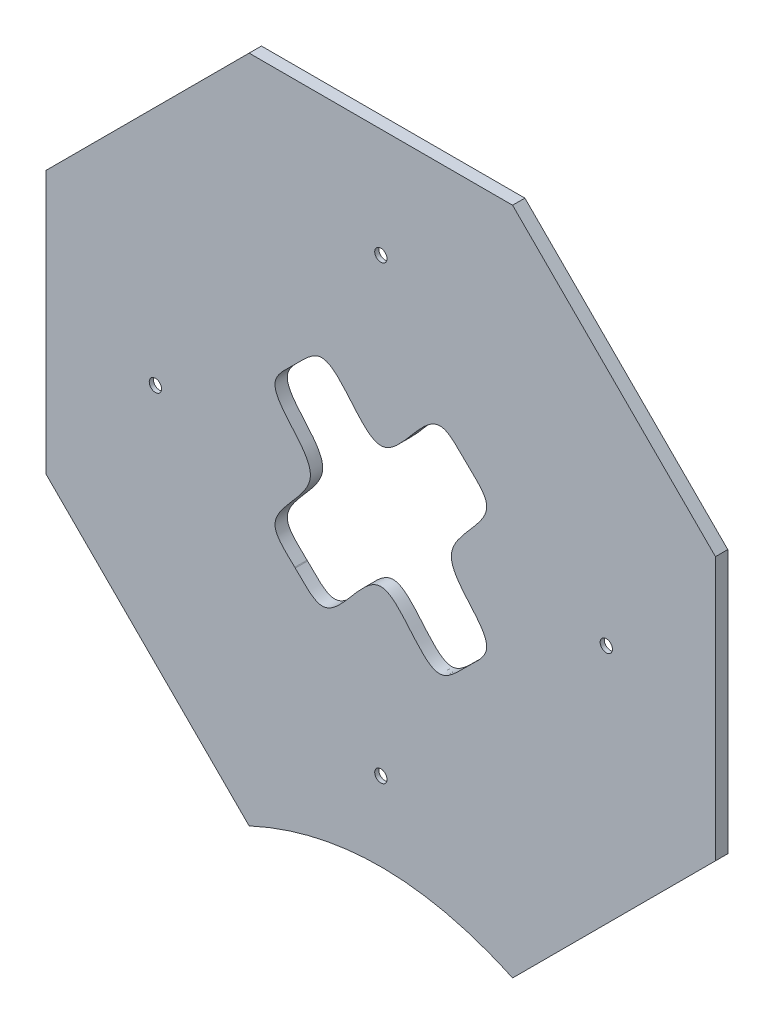
ISO-10303-21;
HEADER;
FILE_DESCRIPTION(('STEP AP214'),'2;1');
FILE_NAME('part.step','',(''),(''),'','','');
FILE_SCHEMA(('AUTOMOTIVE_DESIGN { 1 0 10303 214 1 1 1 1 }'));
ENDSEC;
DATA;
#1=APPLICATION_CONTEXT('core data for automotive mechanical design processes');
#2=APPLICATION_PROTOCOL_DEFINITION('international standard','automotive_design',2000,#1);
#3=PRODUCT_CONTEXT('',#1,'mechanical');
#4=PRODUCT('Part','Part','',(#3));
#5=PRODUCT_RELATED_PRODUCT_CATEGORY('part','',(#4));
#6=PRODUCT_DEFINITION_FORMATION('','',#4);
#7=PRODUCT_DEFINITION_CONTEXT('part definition',#1,'design');
#8=PRODUCT_DEFINITION('design','',#6,#7);
#9=PRODUCT_DEFINITION_SHAPE('','',#8);
#10=(LENGTH_UNIT() NAMED_UNIT(*) SI_UNIT(.MILLI.,.METRE.));
#11=(NAMED_UNIT(*) PLANE_ANGLE_UNIT() SI_UNIT($,.RADIAN.));
#12=(NAMED_UNIT(*) SI_UNIT($,.STERADIAN.) SOLID_ANGLE_UNIT());
#13=UNCERTAINTY_MEASURE_WITH_UNIT(LENGTH_MEASURE(1.E-05),#10,'distance_accuracy_value','');
#14=(GEOMETRIC_REPRESENTATION_CONTEXT(3) GLOBAL_UNCERTAINTY_ASSIGNED_CONTEXT((#13)) GLOBAL_UNIT_ASSIGNED_CONTEXT((#10,
#11,#12)) REPRESENTATION_CONTEXT('',''));
#15=CARTESIAN_POINT('',(0.,0.,0.));
#16=DIRECTION('',(0.,0.,1.));
#17=DIRECTION('',(1.,0.,0.));
#18=AXIS2_PLACEMENT_3D('',#15,#16,#17);
#19=CARTESIAN_POINT('',(-0.00837364830301445,-74.1853267775126,3.));
#20=DIRECTION('',(0.,0.,1.));
#21=DIRECTION('',(1.,0.,0.));
#22=AXIS2_PLACEMENT_3D('',#19,#20,#21);
#23=PLANE('',#22);
#24=CARTESIAN_POINT('',(0.,55.,3.));
#25=DIRECTION('',(0.,0.,1.));
#26=DIRECTION('',(1.,0.,0.));
#27=AXIS2_PLACEMENT_3D('',#24,#25,#26);
#28=CIRCLE('',#27,1.5);
#29=CARTESIAN_POINT('',(1.5,55.,3.));
#30=VERTEX_POINT('',#29);
#31=EDGE_CURVE('E193',#30,#30,#28,.T.);
#32=ORIENTED_EDGE('',*,*,#31,.F.);
#33=EDGE_LOOP('',(#32));
#34=FACE_BOUND('',#33,.T.);
#35=CARTESIAN_POINT('',(-55.,0.,3.));
#36=DIRECTION('',(0.,0.,1.));
#37=DIRECTION('',(1.,0.,0.));
#38=AXIS2_PLACEMENT_3D('',#35,#36,#37);
#39=CIRCLE('',#38,1.5);
#40=CARTESIAN_POINT('',(-53.5,0.,3.));
#41=VERTEX_POINT('',#40);
#42=EDGE_CURVE('E200',#41,#41,#39,.T.);
#43=ORIENTED_EDGE('',*,*,#42,.F.);
#44=EDGE_LOOP('',(#43));
#45=FACE_BOUND('',#44,.T.);
#46=CARTESIAN_POINT('',(0.,-55.,3.));
#47=DIRECTION('',(0.,0.,1.));
#48=DIRECTION('',(1.,0.,0.));
#49=AXIS2_PLACEMENT_3D('',#46,#47,#48);
#50=CIRCLE('',#49,1.5);
#51=CARTESIAN_POINT('',(1.49999999999999,-55.,3.));
#52=VERTEX_POINT('',#51);
#53=EDGE_CURVE('E204',#52,#52,#50,.T.);
#54=ORIENTED_EDGE('',*,*,#53,.F.);
#55=EDGE_LOOP('',(#54));
#56=FACE_BOUND('',#55,.T.);
#57=CARTESIAN_POINT('',(55.,0.,3.));
#58=DIRECTION('',(0.,0.,1.));
#59=DIRECTION('',(1.,0.,0.));
#60=AXIS2_PLACEMENT_3D('',#57,#58,#59);
#61=CIRCLE('',#60,1.5);
#62=CARTESIAN_POINT('',(56.5,0.,3.));
#63=VERTEX_POINT('',#62);
#64=EDGE_CURVE('E209',#63,#63,#61,.T.);
#65=ORIENTED_EDGE('',*,*,#64,.F.);
#66=EDGE_LOOP('',(#65));
#67=FACE_BOUND('',#66,.T.);
#68=DIRECTION('',(-0.707106781186548,-0.707106781186548,0.));
#69=VECTOR('',#68,1.);
#70=CARTESIAN_POINT('',(-81.6309432949496,32.1334686118915,3.));
#71=LINE('',#70,#69);
#72=CARTESIAN_POINT('',(-32.1334686118913,81.6309432949497,3.));
#73=VERTEX_POINT('',#72);
#74=CARTESIAN_POINT('',(-81.6309432949496,32.1334686118915,3.));
#75=VERTEX_POINT('',#74);
#76=EDGE_CURVE('E393',#73,#75,#71,.T.);
#77=ORIENTED_EDGE('',*,*,#76,.T.);
#78=DIRECTION('',(0.,-1.,0.));
#79=VECTOR('',#78,1.);
#80=CARTESIAN_POINT('',(-81.6309432949497,-32.1334686118914,3.));
#81=LINE('',#80,#79);
#82=CARTESIAN_POINT('',(-81.6309432949497,-32.1334686118914,3.));
#83=VERTEX_POINT('',#82);
#84=EDGE_CURVE('E452',#75,#83,#81,.T.);
#85=ORIENTED_EDGE('',*,*,#84,.T.);
#86=DIRECTION('',(0.707106781186548,-0.707106781186547,0.));
#87=VECTOR('',#86,1.);
#88=CARTESIAN_POINT('',(-81.6309432949497,-32.1334686118914,3.));
#89=LINE('',#88,#87);
#90=CARTESIAN_POINT('',(-32.1334686118914,-81.6309432949497,3.));
#91=VERTEX_POINT('',#90);
#92=EDGE_CURVE('E362',#83,#91,#89,.T.);
#93=ORIENTED_EDGE('',*,*,#92,.T.);
#94=CARTESIAN_POINT('',(-32.1334686118914,-81.6309432949497,3.));
#95=CARTESIAN_POINT('',(-26.3156049046951,-78.9294696006556,3.));
#96=CARTESIAN_POINT('',(-17.4584669723134,-75.9069292399536,3.));
#97=CARTESIAN_POINT('',(-6.45984668604864,-74.3669710311353,3.));
#98=CARTESIAN_POINT('',(0.503945587693919,-74.0955401463674,3.));
#99=CARTESIAN_POINT('',(13.3814106526898,-74.7374091827583,3.));
#100=CARTESIAN_POINT('',(24.1945271322703,-77.919288078662,3.));
#101=CARTESIAN_POINT('',(32.1334686118914,-81.6309432949497,3.));
#102=B_SPLINE_CURVE_WITH_KNOTS('',3,(#94,#95,#96,#97,#98,#99,#100,#101),.UNSPECIFIED.,.F.,.F.,
(4,1,1,1,1,4),(0.,0.289771887582284,0.418866631486402,0.500125987798941,0.60414879767023,1.),.UNSPECIFIED.);
#103=CARTESIAN_POINT('',(32.1334686118914,-81.6309432949497,3.));
#104=VERTEX_POINT('',#103);
#105=EDGE_CURVE('E355',#91,#104,#102,.T.);
#106=ORIENTED_EDGE('',*,*,#105,.T.);
#107=DIRECTION('',(0.707106781186548,0.707106781186548,0.));
#108=VECTOR('',#107,1.);
#109=CARTESIAN_POINT('',(81.6309432949497,-32.1334686118913,3.));
#110=LINE('',#109,#108);
#111=CARTESIAN_POINT('',(81.6309432949497,-32.1334686118913,3.));
#112=VERTEX_POINT('',#111);
#113=EDGE_CURVE('E361',#104,#112,#110,.T.);
#114=ORIENTED_EDGE('',*,*,#113,.T.);
#115=DIRECTION('',(0.,1.,0.));
#116=VECTOR('',#115,1.);
#117=CARTESIAN_POINT('',(81.6309432949495,32.1334686118916,3.));
#118=LINE('',#117,#116);
#119=CARTESIAN_POINT('',(81.6309432949495,32.1334686118916,3.));
#120=VERTEX_POINT('',#119);
#121=EDGE_CURVE('E368',#112,#120,#118,.T.);
#122=ORIENTED_EDGE('',*,*,#121,.T.);
#123=DIRECTION('',(-0.707106781186548,0.707106781186547,0.));
#124=VECTOR('',#123,1.);
#125=CARTESIAN_POINT('',(32.1334686118912,81.6309432949499,3.));
#126=LINE('',#125,#124);
#127=CARTESIAN_POINT('',(32.1334686118912,81.6309432949499,3.));
#128=VERTEX_POINT('',#127);
#129=EDGE_CURVE('E370',#120,#128,#126,.T.);
#130=ORIENTED_EDGE('',*,*,#129,.T.);
#131=DIRECTION('',(-1.,0.,0.));
#132=VECTOR('',#131,1.);
#133=CARTESIAN_POINT('',(-32.1334686118913,81.6309432949497,3.));
#134=LINE('',#133,#132);
#135=EDGE_CURVE('E372',#128,#73,#134,.T.);
#136=ORIENTED_EDGE('',*,*,#135,.T.);
#137=EDGE_LOOP('',(#77,#85,#93,#106,#114,#122,#130,#136));
#138=FACE_BOUND('',#137,.T.);
#139=CARTESIAN_POINT('',(0.,0.,3.));
#140=DIRECTION('',(0.,0.,1.));
#141=DIRECTION('',(1.,0.,0.));
#142=AXIS2_PLACEMENT_3D('',#139,#140,#141);
#143=CIRCLE('',#142,30.);
#144=CARTESIAN_POINT('',(20.8761875388379,-21.5449482209466,3.));
#145=VERTEX_POINT('',#144);
#146=CARTESIAN_POINT('',(21.0035215914463,-21.4208328679732,3.));
#147=VERTEX_POINT('',#146);
#148=EDGE_CURVE('E187',#145,#147,#143,.T.);
#149=ORIENTED_EDGE('',*,*,#148,.F.);
#150=CARTESIAN_POINT('',(25.7791432225064,15.3439165376218,3.));
#151=CARTESIAN_POINT('',(25.4447826016638,17.4044269315893,3.));
#152=CARTESIAN_POINT('',(20.8148626779876,21.2530797879394,3.));
#153=CARTESIAN_POINT('',(11.9280025453874,31.5453885295995,3.));
#154=CARTESIAN_POINT('',(-1.31697226615439E-05,2.95398748231153,3.));
#155=CARTESIAN_POINT('',(-11.9277073017081,31.5450454307785,3.));
#156=CARTESIAN_POINT('',(-20.8141570227704,21.2538219966054,3.));
#157=CARTESIAN_POINT('',(-30.670361400667,13.0612404995459,3.));
#158=CARTESIAN_POINT('',(-7.85107217383646,0.0019199857128657,3.));
#159=CARTESIAN_POINT('',(-30.702175926902,-13.1019036028812,3.));
#160=CARTESIAN_POINT('',(-20.7280792096631,-21.3290331697275,3.));
#161=CARTESIAN_POINT('',(-11.794640133976,-31.6225437712034,3.));
#162=CARTESIAN_POINT('',(-1.28478928732675E-05,-3.37797178714296,3.));
#163=CARTESIAN_POINT('',(11.7949337776093,-31.6228880227262,3.));
#164=CARTESIAN_POINT('',(20.728788660096,-21.3282930527908,3.));
#165=CARTESIAN_POINT('',(30.7023404188019,-13.1011511048863,3.));
#166=CARTESIAN_POINT('',(7.85812244118582,0.00191908887170179,3.));
#167=CARTESIAN_POINT('',(26.533922641217,10.6925588703019,3.));
#168=CARTESIAN_POINT('',(25.7791432225064,15.3439165376218,3.));
#169=B_SPLINE_CURVE_WITH_KNOTS('',3,(#150,#151,#152,#153,#154,#155,#156,#157,#158,#159,#160,
#161,#162,#163,#164,#165,#166,#167,#168),.UNSPECIFIED.,.T.,.F.,(4,1,1,1,1,1,1,1,1,1,1,1,1,1,1,1,
4),(0.,0.0376201826074288,0.0752403652148576,0.165070914218758,0.254901463222658,
0.292516948369074,0.33013243351549,0.415069121175203,0.500005808834917,0.538178926786656,
0.576352044738394,0.665075110789972,0.75379817684155,0.791975991051629,0.830153805261708,
0.915076902630854,1.),.UNSPECIFIED.);
#170=CARTESIAN_POINT('',(-20.8754830316129,-21.5456308377555,3.));
#171=VERTEX_POINT('',#170);
#172=EDGE_CURVE('E254',#145,#171,#169,.F.);
#173=ORIENTED_EDGE('',*,*,#172,.T.);
#174=CARTESIAN_POINT('',(-21.0029062001521,-21.4214362531464,3.));
#175=VERTEX_POINT('',#174);
#176=EDGE_CURVE('E190',#175,#171,#143,.T.);
#177=ORIENTED_EDGE('',*,*,#176,.F.);
#178=CARTESIAN_POINT('',(-21.0634485387842,21.3619085208694,3.));
#179=VERTEX_POINT('',#178);
#180=EDGE_CURVE('E644',#175,#179,#169,.F.);
#181=ORIENTED_EDGE('',*,*,#180,.T.);
#182=CARTESIAN_POINT('',(-20.9589690635374,21.4644267520398,3.));
#183=VERTEX_POINT('',#182);
#184=EDGE_CURVE('E188',#183,#179,#143,.T.);
#185=ORIENTED_EDGE('',*,*,#184,.F.);
#186=CARTESIAN_POINT('',(20.9596709160953,21.4637414047222,3.));
#187=VERTEX_POINT('',#186);
#188=EDGE_CURVE('E239',#183,#187,#169,.F.);
#189=ORIENTED_EDGE('',*,*,#188,.T.);
#190=CARTESIAN_POINT('',(21.0640620201888,21.3613035934055,3.));
#191=VERTEX_POINT('',#190);
#192=EDGE_CURVE('E184',#191,#187,#143,.T.);
#193=ORIENTED_EDGE('',*,*,#192,.F.);
#194=EDGE_CURVE('E163',#191,#147,#169,.F.);
#195=ORIENTED_EDGE('',*,*,#194,.T.);
#196=EDGE_LOOP('',(#149,#173,#177,#181,#185,#189,#193,#195));
#197=FACE_BOUND('',#196,.T.);
#198=ADVANCED_FACE('F36',(#34,#45,#56,#67,#138,#197),#23,.T.);
#199=CARTESIAN_POINT('',(-0.00837364830301445,-74.1853267775126,0.));
#200=DIRECTION('',(0.,0.,1.));
#201=DIRECTION('',(1.,0.,0.));
#202=AXIS2_PLACEMENT_3D('',#199,#200,#201);
#203=PLANE('',#202);
#204=CARTESIAN_POINT('',(55.,0.,0.));
#205=DIRECTION('',(0.,0.,-1.));
#206=DIRECTION('',(-1.,0.,0.));
#207=AXIS2_PLACEMENT_3D('',#204,#205,#206);
#208=CIRCLE('',#207,5.);
#209=CARTESIAN_POINT('',(50.,0.,0.));
#210=VERTEX_POINT('',#209);
#211=EDGE_CURVE('E230',#210,#210,#208,.T.);
#212=ORIENTED_EDGE('',*,*,#211,.F.);
#213=EDGE_LOOP('',(#212));
#214=FACE_BOUND('',#213,.T.);
#215=CARTESIAN_POINT('',(0.,-55.,0.));
#216=DIRECTION('',(0.,0.,-1.));
#217=DIRECTION('',(-1.,0.,0.));
#218=AXIS2_PLACEMENT_3D('',#215,#216,#217);
#219=CIRCLE('',#218,5.);
#220=CARTESIAN_POINT('',(-5.00000000000001,-55.,0.));
#221=VERTEX_POINT('',#220);
#222=EDGE_CURVE('E227',#221,#221,#219,.T.);
#223=ORIENTED_EDGE('',*,*,#222,.F.);
#224=EDGE_LOOP('',(#223));
#225=FACE_BOUND('',#224,.T.);
#226=CARTESIAN_POINT('',(-55.,0.,0.));
#227=DIRECTION('',(0.,0.,-1.));
#228=DIRECTION('',(-1.,0.,0.));
#229=AXIS2_PLACEMENT_3D('',#226,#227,#228);
#230=CIRCLE('',#229,5.);
#231=CARTESIAN_POINT('',(-60.,0.,0.));
#232=VERTEX_POINT('',#231);
#233=EDGE_CURVE('E221',#232,#232,#230,.T.);
#234=ORIENTED_EDGE('',*,*,#233,.F.);
#235=EDGE_LOOP('',(#234));
#236=FACE_BOUND('',#235,.T.);
#237=CARTESIAN_POINT('',(0.,55.,0.));
#238=DIRECTION('',(0.,0.,-1.));
#239=DIRECTION('',(-1.,0.,0.));
#240=AXIS2_PLACEMENT_3D('',#237,#238,#239);
#241=CIRCLE('',#240,5.);
#242=CARTESIAN_POINT('',(-5.,55.,0.));
#243=VERTEX_POINT('',#242);
#244=EDGE_CURVE('E215',#243,#243,#241,.T.);
#245=ORIENTED_EDGE('',*,*,#244,.F.);
#246=EDGE_LOOP('',(#245));
#247=FACE_BOUND('',#246,.T.);
#248=DIRECTION('',(-0.707106781186548,-0.707106781186548,0.));
#249=VECTOR('',#248,1.);
#250=CARTESIAN_POINT('',(-81.6309432949496,32.1334686118915,0.));
#251=LINE('',#250,#249);
#252=CARTESIAN_POINT('',(-32.1334686118913,81.6309432949497,0.));
#253=VERTEX_POINT('',#252);
#254=CARTESIAN_POINT('',(-81.6309432949496,32.1334686118915,0.));
#255=VERTEX_POINT('',#254);
#256=EDGE_CURVE('E174',#253,#255,#251,.T.);
#257=ORIENTED_EDGE('',*,*,#256,.F.);
#258=DIRECTION('',(-1.,0.,0.));
#259=VECTOR('',#258,1.);
#260=CARTESIAN_POINT('',(-32.1334686118913,81.6309432949497,0.));
#261=LINE('',#260,#259);
#262=CARTESIAN_POINT('',(32.1334686118912,81.6309432949499,0.));
#263=VERTEX_POINT('',#262);
#264=EDGE_CURVE('E391',#263,#253,#261,.T.);
#265=ORIENTED_EDGE('',*,*,#264,.F.);
#266=DIRECTION('',(-0.707106781186548,0.707106781186547,0.));
#267=VECTOR('',#266,1.);
#268=CARTESIAN_POINT('',(32.1334686118912,81.6309432949499,0.));
#269=LINE('',#268,#267);
#270=CARTESIAN_POINT('',(81.6309432949495,32.1334686118916,0.));
#271=VERTEX_POINT('',#270);
#272=EDGE_CURVE('E389',#271,#263,#269,.T.);
#273=ORIENTED_EDGE('',*,*,#272,.F.);
#274=DIRECTION('',(0.,1.,0.));
#275=VECTOR('',#274,1.);
#276=CARTESIAN_POINT('',(81.6309432949495,32.1334686118916,0.));
#277=LINE('',#276,#275);
#278=CARTESIAN_POINT('',(81.6309432949497,-32.1334686118913,0.));
#279=VERTEX_POINT('',#278);
#280=EDGE_CURVE('E387',#279,#271,#277,.T.);
#281=ORIENTED_EDGE('',*,*,#280,.F.);
#282=DIRECTION('',(0.707106781186548,0.707106781186548,0.));
#283=VECTOR('',#282,1.);
#284=CARTESIAN_POINT('',(81.6309432949497,-32.1334686118913,0.));
#285=LINE('',#284,#283);
#286=CARTESIAN_POINT('',(32.1334686118914,-81.6309432949497,0.));
#287=VERTEX_POINT('',#286);
#288=EDGE_CURVE('E382',#287,#279,#285,.T.);
#289=ORIENTED_EDGE('',*,*,#288,.F.);
#290=CARTESIAN_POINT('',(-32.1334686118914,-81.6309432949497,0.));
#291=CARTESIAN_POINT('',(-26.3156049046951,-78.9294696006556,0.));
#292=CARTESIAN_POINT('',(-17.4584669723134,-75.9069292399536,0.));
#293=CARTESIAN_POINT('',(-6.45984668604864,-74.3669710311353,0.));
#294=CARTESIAN_POINT('',(0.503945587693919,-74.0955401463674,0.));
#295=CARTESIAN_POINT('',(13.3814106526898,-74.7374091827583,0.));
#296=CARTESIAN_POINT('',(24.1945271322703,-77.919288078662,0.));
#297=CARTESIAN_POINT('',(32.1334686118914,-81.6309432949497,0.));
#298=B_SPLINE_CURVE_WITH_KNOTS('',3,(#290,#291,#292,#293,#294,#295,#296,#297),.UNSPECIFIED.,.F.,
.F.,(4,1,1,1,1,4),(0.,0.289771887582284,0.418866631486402,0.500125987798941,0.60414879767023,
1.),.UNSPECIFIED.);
#299=CARTESIAN_POINT('',(-32.1334686118914,-81.6309432949497,0.));
#300=VERTEX_POINT('',#299);
#301=EDGE_CURVE('E378',#300,#287,#298,.T.);
#302=ORIENTED_EDGE('',*,*,#301,.F.);
#303=DIRECTION('',(0.707106781186548,-0.707106781186547,0.));
#304=VECTOR('',#303,1.);
#305=CARTESIAN_POINT('',(-81.6309432949497,-32.1334686118914,0.));
#306=LINE('',#305,#304);
#307=CARTESIAN_POINT('',(-81.6309432949497,-32.1334686118914,0.));
#308=VERTEX_POINT('',#307);
#309=EDGE_CURVE('E376',#308,#300,#306,.T.);
#310=ORIENTED_EDGE('',*,*,#309,.F.);
#311=DIRECTION('',(0.,-1.,0.));
#312=VECTOR('',#311,1.);
#313=CARTESIAN_POINT('',(-81.6309432949497,-32.1334686118914,0.));
#314=LINE('',#313,#312);
#315=EDGE_CURVE('E178',#255,#308,#314,.T.);
#316=ORIENTED_EDGE('',*,*,#315,.F.);
#317=EDGE_LOOP('',(#257,#265,#273,#281,#289,#302,#310,#316));
#318=FACE_BOUND('',#317,.T.);
#319=CARTESIAN_POINT('',(25.7791432225064,15.3439165376218,0.));
#320=CARTESIAN_POINT('',(25.4447826016638,17.4044269315893,0.));
#321=CARTESIAN_POINT('',(20.8148626779876,21.2530797879394,0.));
#322=CARTESIAN_POINT('',(11.9280025453874,31.5453885295995,0.));
#323=CARTESIAN_POINT('',(-1.31697226615439E-05,2.95398748231153,0.));
#324=CARTESIAN_POINT('',(-11.9277073017081,31.5450454307785,0.));
#325=CARTESIAN_POINT('',(-20.8141570227704,21.2538219966054,0.));
#326=CARTESIAN_POINT('',(-30.670361400667,13.0612404995459,0.));
#327=CARTESIAN_POINT('',(-7.85107217383646,0.0019199857128657,0.));
#328=CARTESIAN_POINT('',(-30.702175926902,-13.1019036028812,0.));
#329=CARTESIAN_POINT('',(-20.7280792096631,-21.3290331697275,0.));
#330=CARTESIAN_POINT('',(-11.794640133976,-31.6225437712034,0.));
#331=CARTESIAN_POINT('',(-1.28478928732675E-05,-3.37797178714296,0.));
#332=CARTESIAN_POINT('',(11.7949337776093,-31.6228880227262,0.));
#333=CARTESIAN_POINT('',(20.728788660096,-21.3282930527908,0.));
#334=CARTESIAN_POINT('',(30.7023404188019,-13.1011511048863,0.));
#335=CARTESIAN_POINT('',(7.85812244118582,0.00191908887170179,0.));
#336=CARTESIAN_POINT('',(26.533922641217,10.6925588703019,0.));
#337=CARTESIAN_POINT('',(25.7791432225064,15.3439165376218,0.));
#338=B_SPLINE_CURVE_WITH_KNOTS('',3,(#319,#320,#321,#322,#323,#324,#325,#326,#327,#328,#329,
#330,#331,#332,#333,#334,#335,#336,#337),.UNSPECIFIED.,.T.,.F.,(4,1,1,1,1,1,1,1,1,1,1,1,1,1,1,1,
4),(0.,0.0376201826074288,0.0752403652148576,0.165070914218758,0.254901463222658,
0.292516948369074,0.33013243351549,0.415069121175203,0.500005808834917,0.538178926786656,
0.576352044738394,0.665075110789972,0.75379817684155,0.791975991051629,0.830153805261708,
0.915076902630854,1.),.UNSPECIFIED.);
#339=CARTESIAN_POINT('',(-20.8754830316062,-21.545630837762,0.));
#340=VERTEX_POINT('',#339);
#341=CARTESIAN_POINT('',(20.8761875388376,-21.5449482209469,0.));
#342=VERTEX_POINT('',#341);
#343=EDGE_CURVE('E61',#340,#342,#338,.T.);
#344=ORIENTED_EDGE('',*,*,#343,.T.);
#345=CARTESIAN_POINT('',(0.,0.,0.));
#346=DIRECTION('',(0.,0.,1.));
#347=DIRECTION('',(1.,0.,0.));
#348=AXIS2_PLACEMENT_3D('',#345,#346,#347);
#349=CIRCLE('',#348,30.);
#350=CARTESIAN_POINT('',(21.0035215914728,-21.4208328679474,0.));
#351=VERTEX_POINT('',#350);
#352=EDGE_CURVE('E157',#342,#351,#349,.T.);
#353=ORIENTED_EDGE('',*,*,#352,.T.);
#354=CARTESIAN_POINT('',(21.0640620201881,21.3613035934062,0.));
#355=VERTEX_POINT('',#354);
#356=EDGE_CURVE('E53',#351,#355,#338,.T.);
#357=ORIENTED_EDGE('',*,*,#356,.T.);
#358=CARTESIAN_POINT('',(20.9596709154401,21.4637414053667,0.));
#359=VERTEX_POINT('',#358);
#360=EDGE_CURVE('E155',#355,#359,#349,.T.);
#361=ORIENTED_EDGE('',*,*,#360,.T.);
#362=CARTESIAN_POINT('',(-20.9589690635377,21.4644267520395,0.));
#363=VERTEX_POINT('',#362);
#364=EDGE_CURVE('E159',#359,#363,#338,.T.);
#365=ORIENTED_EDGE('',*,*,#364,.T.);
#366=CARTESIAN_POINT('',(-21.0634485387842,21.3619085208693,0.));
#367=VERTEX_POINT('',#366);
#368=EDGE_CURVE('E176',#363,#367,#349,.T.);
#369=ORIENTED_EDGE('',*,*,#368,.T.);
#370=CARTESIAN_POINT('',(-21.0029062001519,-21.4214362531466,0.));
#371=VERTEX_POINT('',#370);
#372=EDGE_CURVE('E645',#367,#371,#338,.T.);
#373=ORIENTED_EDGE('',*,*,#372,.T.);
#374=EDGE_CURVE('E180',#371,#340,#349,.T.);
#375=ORIENTED_EDGE('',*,*,#374,.T.);
#376=EDGE_LOOP('',(#344,#353,#357,#361,#365,#369,#373,#375));
#377=FACE_BOUND('',#376,.T.);
#378=ADVANCED_FACE('F153',(#214,#225,#236,#247,#318,#377),#203,.F.);
#379=CARTESIAN_POINT('',(0.,0.,0.));
#380=DIRECTION('',(0.,0.,1.));
#381=DIRECTION('',(1.,0.,0.));
#382=AXIS2_PLACEMENT_3D('',#379,#380,#381);
#383=CYLINDRICAL_SURFACE('',#382,30.);
#384=DIRECTION('',(0.,0.,-1.));
#385=VECTOR('',#384,1.);
#386=CARTESIAN_POINT('',(21.0640620201875,21.3613035934068,14.));
#387=LINE('',#386,#385);
#388=EDGE_CURVE('E161',#191,#355,#387,.T.);
#389=ORIENTED_EDGE('',*,*,#388,.F.);
#390=ORIENTED_EDGE('',*,*,#192,.T.);
#391=DIRECTION('',(0.,0.,-1.));
#392=VECTOR('',#391,1.);
#393=CARTESIAN_POINT('',(20.9596709154398,21.463741405367,14.));
#394=LINE('',#393,#392);
#395=EDGE_CURVE('E173',#359,#187,#394,.F.);
#396=ORIENTED_EDGE('',*,*,#395,.F.);
#397=ORIENTED_EDGE('',*,*,#360,.F.);
#398=EDGE_LOOP('',(#389,#390,#396,#397));
#399=FACE_BOUND('',#398,.T.);
#400=ADVANCED_FACE('F171',(#399),#383,.F.);
#401=DIRECTION('',(0.,0.,-1.));
#402=VECTOR('',#401,1.);
#403=CARTESIAN_POINT('',(20.8761875388379,-21.5449482209466,14.));
#404=LINE('',#403,#402);
#405=EDGE_CURVE('E237',#145,#342,#404,.T.);
#406=ORIENTED_EDGE('',*,*,#405,.F.);
#407=ORIENTED_EDGE('',*,*,#148,.T.);
#408=DIRECTION('',(0.,0.,-1.));
#409=VECTOR('',#408,1.);
#410=CARTESIAN_POINT('',(21.0035215914748,-21.4208328679455,14.));
#411=LINE('',#410,#409);
#412=EDGE_CURVE('E167',#351,#147,#411,.F.);
#413=ORIENTED_EDGE('',*,*,#412,.F.);
#414=ORIENTED_EDGE('',*,*,#352,.F.);
#415=EDGE_LOOP('',(#406,#407,#413,#414));
#416=FACE_BOUND('',#415,.T.);
#417=ADVANCED_FACE('F327',(#416),#383,.F.);
#418=DIRECTION('',(0.,0.,-1.));
#419=VECTOR('',#418,1.);
#420=CARTESIAN_POINT('',(-21.0029062001521,-21.4214362531464,14.));
#421=LINE('',#420,#419);
#422=EDGE_CURVE('E240',#175,#371,#421,.T.);
#423=ORIENTED_EDGE('',*,*,#422,.F.);
#424=ORIENTED_EDGE('',*,*,#176,.T.);
#425=DIRECTION('',(0.,0.,-1.));
#426=VECTOR('',#425,1.);
#427=CARTESIAN_POINT('',(-20.8754830316062,-21.545630837762,14.));
#428=LINE('',#427,#426);
#429=EDGE_CURVE('E168',#340,#171,#428,.F.);
#430=ORIENTED_EDGE('',*,*,#429,.F.);
#431=ORIENTED_EDGE('',*,*,#374,.F.);
#432=EDGE_LOOP('',(#423,#424,#430,#431));
#433=FACE_BOUND('',#432,.T.);
#434=ADVANCED_FACE('F601',(#433),#383,.F.);
#435=DIRECTION('',(0.,0.,-1.));
#436=VECTOR('',#435,1.);
#437=CARTESIAN_POINT('',(-20.9589690635374,21.4644267520398,14.));
#438=LINE('',#437,#436);
#439=EDGE_CURVE('E243',#183,#363,#438,.T.);
#440=ORIENTED_EDGE('',*,*,#439,.F.);
#441=ORIENTED_EDGE('',*,*,#184,.T.);
#442=DIRECTION('',(0.,0.,-1.));
#443=VECTOR('',#442,1.);
#444=CARTESIAN_POINT('',(-21.063448538785,21.3619085208685,14.));
#445=LINE('',#444,#443);
#446=EDGE_CURVE('E246',#367,#179,#445,.F.);
#447=ORIENTED_EDGE('',*,*,#446,.F.);
#448=ORIENTED_EDGE('',*,*,#368,.F.);
#449=EDGE_LOOP('',(#440,#441,#447,#448));
#450=FACE_BOUND('',#449,.T.);
#451=ADVANCED_FACE('F323',(#450),#383,.F.);
#452=CARTESIAN_POINT('',(55.,0.,10.));
#453=DIRECTION('',(0.,0.,-1.));
#454=DIRECTION('',(-1.,0.,0.));
#455=AXIS2_PLACEMENT_3D('',#452,#453,#454);
#456=CYLINDRICAL_SURFACE('',#455,1.5);
#457=ORIENTED_EDGE('',*,*,#64,.T.);
#458=EDGE_LOOP('',(#457));
#459=FACE_BOUND('',#458,.T.);
#460=CARTESIAN_POINT('',(55.,0.,2.));
#461=DIRECTION('',(0.,0.,-1.));
#462=DIRECTION('',(-1.,0.,0.));
#463=AXIS2_PLACEMENT_3D('',#460,#461,#462);
#464=CIRCLE('',#463,1.5);
#465=CARTESIAN_POINT('',(53.5,0.,2.));
#466=VERTEX_POINT('',#465);
#467=EDGE_CURVE('E40',#466,#466,#464,.F.);
#468=ORIENTED_EDGE('',*,*,#467,.F.);
#469=EDGE_LOOP('',(#468));
#470=FACE_BOUND('',#469,.T.);
#471=ADVANCED_FACE('F319',(#459,#470),#456,.F.);
#472=CARTESIAN_POINT('',(0.,-55.,10.));
#473=DIRECTION('',(0.,0.,-1.));
#474=DIRECTION('',(-1.,0.,0.));
#475=AXIS2_PLACEMENT_3D('',#472,#473,#474);
#476=CYLINDRICAL_SURFACE('',#475,1.5);
#477=ORIENTED_EDGE('',*,*,#53,.T.);
#478=EDGE_LOOP('',(#477));
#479=FACE_BOUND('',#478,.T.);
#480=CARTESIAN_POINT('',(0.,-55.,2.));
#481=DIRECTION('',(0.,0.,-1.));
#482=DIRECTION('',(-1.,0.,0.));
#483=AXIS2_PLACEMENT_3D('',#480,#481,#482);
#484=CIRCLE('',#483,1.5);
#485=CARTESIAN_POINT('',(-1.50000000000001,-55.,2.));
#486=VERTEX_POINT('',#485);
#487=EDGE_CURVE('E417',#486,#486,#484,.F.);
#488=ORIENTED_EDGE('',*,*,#487,.F.);
#489=EDGE_LOOP('',(#488));
#490=FACE_BOUND('',#489,.T.);
#491=ADVANCED_FACE('F315',(#479,#490),#476,.F.);
#492=CARTESIAN_POINT('',(-55.,0.,10.));
#493=DIRECTION('',(0.,0.,-1.));
#494=DIRECTION('',(-1.,0.,0.));
#495=AXIS2_PLACEMENT_3D('',#492,#493,#494);
#496=CYLINDRICAL_SURFACE('',#495,1.5);
#497=ORIENTED_EDGE('',*,*,#42,.T.);
#498=EDGE_LOOP('',(#497));
#499=FACE_BOUND('',#498,.T.);
#500=CARTESIAN_POINT('',(-55.,0.,2.));
#501=DIRECTION('',(0.,0.,-1.));
#502=DIRECTION('',(-1.,0.,0.));
#503=AXIS2_PLACEMENT_3D('',#500,#501,#502);
#504=CIRCLE('',#503,1.5);
#505=CARTESIAN_POINT('',(-56.5,0.,2.));
#506=VERTEX_POINT('',#505);
#507=EDGE_CURVE('E415',#506,#506,#504,.F.);
#508=ORIENTED_EDGE('',*,*,#507,.F.);
#509=EDGE_LOOP('',(#508));
#510=FACE_BOUND('',#509,.T.);
#511=ADVANCED_FACE('F312',(#499,#510),#496,.F.);
#512=CARTESIAN_POINT('',(0.,55.,10.));
#513=DIRECTION('',(0.,0.,-1.));
#514=DIRECTION('',(-1.,0.,0.));
#515=AXIS2_PLACEMENT_3D('',#512,#513,#514);
#516=CYLINDRICAL_SURFACE('',#515,1.5);
#517=ORIENTED_EDGE('',*,*,#31,.T.);
#518=EDGE_LOOP('',(#517));
#519=FACE_BOUND('',#518,.T.);
#520=CARTESIAN_POINT('',(0.,55.,2.));
#521=DIRECTION('',(0.,0.,-1.));
#522=DIRECTION('',(-1.,0.,0.));
#523=AXIS2_PLACEMENT_3D('',#520,#521,#522);
#524=CIRCLE('',#523,1.5);
#525=CARTESIAN_POINT('',(-1.5,55.,2.));
#526=VERTEX_POINT('',#525);
#527=EDGE_CURVE('E236',#526,#526,#524,.F.);
#528=ORIENTED_EDGE('',*,*,#527,.F.);
#529=EDGE_LOOP('',(#528));
#530=FACE_BOUND('',#529,.T.);
#531=ADVANCED_FACE('F309',(#519,#530),#516,.F.);
#532=CARTESIAN_POINT('',(-81.6309432949496,32.1334686118915,3.));
#533=DIRECTION('',(0.707106781186547,-0.707106781186547,0.));
#534=DIRECTION('',(0.707106781186548,0.707106781186548,0.));
#535=AXIS2_PLACEMENT_3D('',#532,#533,#534);
#536=PLANE('',#535);
#537=ORIENTED_EDGE('',*,*,#256,.T.);
#538=DIRECTION('',(0.,0.,-1.));
#539=VECTOR('',#538,1.);
#540=CARTESIAN_POINT('',(-81.6309432949496,32.1334686118915,3.));
#541=LINE('',#540,#539);
#542=EDGE_CURVE('E11',#75,#255,#541,.T.);
#543=ORIENTED_EDGE('',*,*,#542,.F.);
#544=ORIENTED_EDGE('',*,*,#76,.F.);
#545=DIRECTION('',(0.,0.,-1.));
#546=VECTOR('',#545,1.);
#547=CARTESIAN_POINT('',(-32.1334686118913,81.6309432949497,3.));
#548=LINE('',#547,#546);
#549=EDGE_CURVE('E373',#73,#253,#548,.T.);
#550=ORIENTED_EDGE('',*,*,#549,.T.);
#551=EDGE_LOOP('',(#537,#543,#544,#550));
#552=FACE_BOUND('',#551,.T.);
#553=ADVANCED_FACE('F38',(#552),#536,.F.);
#554=CARTESIAN_POINT('',(-81.6309432949497,-32.1334686118914,3.));
#555=DIRECTION('',(1.,0.,0.));
#556=DIRECTION('',(0.,1.,0.));
#557=AXIS2_PLACEMENT_3D('',#554,#555,#556);
#558=PLANE('',#557);
#559=ORIENTED_EDGE('',*,*,#315,.T.);
#560=DIRECTION('',(0.,0.,-1.));
#561=VECTOR('',#560,1.);
#562=CARTESIAN_POINT('',(-81.6309432949497,-32.1334686118914,3.));
#563=LINE('',#562,#561);
#564=EDGE_CURVE('E45',#83,#308,#563,.T.);
#565=ORIENTED_EDGE('',*,*,#564,.F.);
#566=ORIENTED_EDGE('',*,*,#84,.F.);
#567=ORIENTED_EDGE('',*,*,#542,.T.);
#568=EDGE_LOOP('',(#559,#565,#566,#567));
#569=FACE_BOUND('',#568,.T.);
#570=ADVANCED_FACE('F458',(#569),#558,.F.);
#571=CARTESIAN_POINT('',(-81.6309432949497,-32.1334686118914,3.));
#572=DIRECTION('',(0.707106781186547,0.707106781186548,0.));
#573=DIRECTION('',(-0.707106781186548,0.707106781186547,0.));
#574=AXIS2_PLACEMENT_3D('',#571,#572,#573);
#575=PLANE('',#574);
#576=ORIENTED_EDGE('',*,*,#309,.T.);
#577=DIRECTION('',(0.,0.,-1.));
#578=VECTOR('',#577,1.);
#579=CARTESIAN_POINT('',(-32.1334686118914,-81.6309432949497,3.));
#580=LINE('',#579,#578);
#581=EDGE_CURVE('E408',#91,#300,#580,.T.);
#582=ORIENTED_EDGE('',*,*,#581,.F.);
#583=ORIENTED_EDGE('',*,*,#92,.F.);
#584=ORIENTED_EDGE('',*,*,#564,.T.);
#585=EDGE_LOOP('',(#576,#582,#583,#584));
#586=FACE_BOUND('',#585,.T.);
#587=ADVANCED_FACE('F353',(#586),#575,.F.);
#588=DIRECTION('',(0.,0.,-1.));
#589=VECTOR('',#588,1.);
#590=SURFACE_OF_LINEAR_EXTRUSION('',#102,#589);
#591=ORIENTED_EDGE('',*,*,#301,.T.);
#592=DIRECTION('',(0.,0.,-1.));
#593=VECTOR('',#592,1.);
#594=CARTESIAN_POINT('',(32.1334686118914,-81.6309432949497,3.));
#595=LINE('',#594,#593);
#596=EDGE_CURVE('E405',#104,#287,#595,.T.);
#597=ORIENTED_EDGE('',*,*,#596,.F.);
#598=ORIENTED_EDGE('',*,*,#105,.F.);
#599=ORIENTED_EDGE('',*,*,#581,.T.);
#600=EDGE_LOOP('',(#591,#597,#598,#599));
#601=FACE_BOUND('',#600,.T.);
#602=ADVANCED_FACE('F348',(#601),#590,.F.);
#603=CARTESIAN_POINT('',(81.6309432949497,-32.1334686118913,3.));
#604=DIRECTION('',(-0.707106781186547,0.707106781186548,0.));
#605=DIRECTION('',(-0.707106781186548,-0.707106781186547,0.));
#606=AXIS2_PLACEMENT_3D('',#603,#604,#605);
#607=PLANE('',#606);
#608=ORIENTED_EDGE('',*,*,#288,.T.);
#609=DIRECTION('',(0.,0.,-1.));
#610=VECTOR('',#609,1.);
#611=CARTESIAN_POINT('',(81.6309432949497,-32.1334686118913,3.));
#612=LINE('',#611,#610);
#613=EDGE_CURVE('E402',#112,#279,#612,.T.);
#614=ORIENTED_EDGE('',*,*,#613,.F.);
#615=ORIENTED_EDGE('',*,*,#113,.F.);
#616=ORIENTED_EDGE('',*,*,#596,.T.);
#617=EDGE_LOOP('',(#608,#614,#615,#616));
#618=FACE_BOUND('',#617,.T.);
#619=ADVANCED_FACE('F344',(#618),#607,.F.);
#620=CARTESIAN_POINT('',(81.6309432949495,32.1334686118916,3.));
#621=DIRECTION('',(-1.,0.,0.));
#622=DIRECTION('',(0.,-1.,0.));
#623=AXIS2_PLACEMENT_3D('',#620,#621,#622);
#624=PLANE('',#623);
#625=ORIENTED_EDGE('',*,*,#280,.T.);
#626=DIRECTION('',(0.,0.,-1.));
#627=VECTOR('',#626,1.);
#628=CARTESIAN_POINT('',(81.6309432949495,32.1334686118916,3.));
#629=LINE('',#628,#627);
#630=EDGE_CURVE('E399',#120,#271,#629,.T.);
#631=ORIENTED_EDGE('',*,*,#630,.F.);
#632=ORIENTED_EDGE('',*,*,#121,.F.);
#633=ORIENTED_EDGE('',*,*,#613,.T.);
#634=EDGE_LOOP('',(#625,#631,#632,#633));
#635=FACE_BOUND('',#634,.T.);
#636=ADVANCED_FACE('F340',(#635),#624,.F.);
#637=CARTESIAN_POINT('',(32.1334686118912,81.6309432949499,3.));
#638=DIRECTION('',(-0.707106781186547,-0.707106781186548,0.));
#639=DIRECTION('',(0.707106781186548,-0.707106781186547,0.));
#640=AXIS2_PLACEMENT_3D('',#637,#638,#639);
#641=PLANE('',#640);
#642=ORIENTED_EDGE('',*,*,#272,.T.);
#643=DIRECTION('',(0.,0.,-1.));
#644=VECTOR('',#643,1.);
#645=CARTESIAN_POINT('',(32.1334686118912,81.6309432949499,3.));
#646=LINE('',#645,#644);
#647=EDGE_CURVE('E396',#128,#263,#646,.T.);
#648=ORIENTED_EDGE('',*,*,#647,.F.);
#649=ORIENTED_EDGE('',*,*,#129,.F.);
#650=ORIENTED_EDGE('',*,*,#630,.T.);
#651=EDGE_LOOP('',(#642,#648,#649,#650));
#652=FACE_BOUND('',#651,.T.);
#653=ADVANCED_FACE('F336',(#652),#641,.F.);
#654=CARTESIAN_POINT('',(-32.1334686118913,81.6309432949497,3.));
#655=DIRECTION('',(0.,-1.,0.));
#656=DIRECTION('',(1.,0.,0.));
#657=AXIS2_PLACEMENT_3D('',#654,#655,#656);
#658=PLANE('',#657);
#659=ORIENTED_EDGE('',*,*,#264,.T.);
#660=ORIENTED_EDGE('',*,*,#549,.F.);
#661=ORIENTED_EDGE('',*,*,#135,.F.);
#662=ORIENTED_EDGE('',*,*,#647,.T.);
#663=EDGE_LOOP('',(#659,#660,#661,#662));
#664=FACE_BOUND('',#663,.T.);
#665=ADVANCED_FACE('F307',(#664),#658,.F.);
#666=CARTESIAN_POINT('',(0.,55.,2.));
#667=DIRECTION('',(0.,0.,-1.));
#668=DIRECTION('',(-1.,0.,0.));
#669=AXIS2_PLACEMENT_3D('',#666,#667,#668);
#670=PLANE('',#669);
#671=CARTESIAN_POINT('',(0.,55.,2.));
#672=DIRECTION('',(0.,0.,-1.));
#673=DIRECTION('',(-1.,0.,0.));
#674=AXIS2_PLACEMENT_3D('',#671,#672,#673);
#675=CIRCLE('',#674,5.);
#676=CARTESIAN_POINT('',(-5.,55.,2.));
#677=VERTEX_POINT('',#676);
#678=EDGE_CURVE('E212',#677,#677,#675,.T.);
#679=ORIENTED_EDGE('',*,*,#678,.T.);
#680=EDGE_LOOP('',(#679));
#681=FACE_BOUND('',#680,.T.);
#682=ORIENTED_EDGE('',*,*,#527,.T.);
#683=EDGE_LOOP('',(#682));
#684=FACE_BOUND('',#683,.T.);
#685=ADVANCED_FACE('F303',(#681,#684),#670,.T.);
#686=CARTESIAN_POINT('',(0.,55.,2.));
#687=DIRECTION('',(0.,0.,-1.));
#688=DIRECTION('',(-1.,0.,0.));
#689=AXIS2_PLACEMENT_3D('',#686,#687,#688);
#690=CYLINDRICAL_SURFACE('',#689,5.);
#691=ORIENTED_EDGE('',*,*,#678,.F.);
#692=EDGE_LOOP('',(#691));
#693=FACE_BOUND('',#692,.T.);
#694=ORIENTED_EDGE('',*,*,#244,.T.);
#695=EDGE_LOOP('',(#694));
#696=FACE_BOUND('',#695,.T.);
#697=ADVANCED_FACE('F299',(#693,#696),#690,.F.);
#698=CARTESIAN_POINT('',(-55.,0.,2.));
#699=DIRECTION('',(0.,0.,-1.));
#700=DIRECTION('',(-1.,0.,0.));
#701=AXIS2_PLACEMENT_3D('',#698,#699,#700);
#702=PLANE('',#701);
#703=CARTESIAN_POINT('',(-55.,0.,2.));
#704=DIRECTION('',(0.,0.,-1.));
#705=DIRECTION('',(-1.,0.,0.));
#706=AXIS2_PLACEMENT_3D('',#703,#704,#705);
#707=CIRCLE('',#706,5.);
#708=CARTESIAN_POINT('',(-60.,0.,2.));
#709=VERTEX_POINT('',#708);
#710=EDGE_CURVE('E218',#709,#709,#707,.T.);
#711=ORIENTED_EDGE('',*,*,#710,.T.);
#712=EDGE_LOOP('',(#711));
#713=FACE_BOUND('',#712,.T.);
#714=ORIENTED_EDGE('',*,*,#507,.T.);
#715=EDGE_LOOP('',(#714));
#716=FACE_BOUND('',#715,.T.);
#717=ADVANCED_FACE('F295',(#713,#716),#702,.T.);
#718=CARTESIAN_POINT('',(-55.,0.,2.));
#719=DIRECTION('',(0.,0.,-1.));
#720=DIRECTION('',(-1.,0.,0.));
#721=AXIS2_PLACEMENT_3D('',#718,#719,#720);
#722=CYLINDRICAL_SURFACE('',#721,5.);
#723=ORIENTED_EDGE('',*,*,#710,.F.);
#724=EDGE_LOOP('',(#723));
#725=FACE_BOUND('',#724,.T.);
#726=ORIENTED_EDGE('',*,*,#233,.T.);
#727=EDGE_LOOP('',(#726));
#728=FACE_BOUND('',#727,.T.);
#729=ADVANCED_FACE('F291',(#725,#728),#722,.F.);
#730=CARTESIAN_POINT('',(0.,-55.,2.));
#731=DIRECTION('',(0.,0.,-1.));
#732=DIRECTION('',(-1.,0.,0.));
#733=AXIS2_PLACEMENT_3D('',#730,#731,#732);
#734=PLANE('',#733);
#735=CARTESIAN_POINT('',(0.,-55.,2.));
#736=DIRECTION('',(0.,0.,-1.));
#737=DIRECTION('',(-1.,0.,0.));
#738=AXIS2_PLACEMENT_3D('',#735,#736,#737);
#739=CIRCLE('',#738,5.);
#740=CARTESIAN_POINT('',(-5.00000000000001,-55.,2.));
#741=VERTEX_POINT('',#740);
#742=EDGE_CURVE('E224',#741,#741,#739,.T.);
#743=ORIENTED_EDGE('',*,*,#742,.T.);
#744=EDGE_LOOP('',(#743));
#745=FACE_BOUND('',#744,.T.);
#746=ORIENTED_EDGE('',*,*,#487,.T.);
#747=EDGE_LOOP('',(#746));
#748=FACE_BOUND('',#747,.T.);
#749=ADVANCED_FACE('F287',(#745,#748),#734,.T.);
#750=CARTESIAN_POINT('',(0.,-55.,2.));
#751=DIRECTION('',(0.,0.,-1.));
#752=DIRECTION('',(-1.,0.,0.));
#753=AXIS2_PLACEMENT_3D('',#750,#751,#752);
#754=CYLINDRICAL_SURFACE('',#753,5.);
#755=ORIENTED_EDGE('',*,*,#742,.F.);
#756=EDGE_LOOP('',(#755));
#757=FACE_BOUND('',#756,.T.);
#758=ORIENTED_EDGE('',*,*,#222,.T.);
#759=EDGE_LOOP('',(#758));
#760=FACE_BOUND('',#759,.T.);
#761=ADVANCED_FACE('F279',(#757,#760),#754,.F.);
#762=CARTESIAN_POINT('',(55.,0.,2.));
#763=DIRECTION('',(0.,0.,-1.));
#764=DIRECTION('',(-1.,0.,0.));
#765=AXIS2_PLACEMENT_3D('',#762,#763,#764);
#766=PLANE('',#765);
#767=CARTESIAN_POINT('',(55.,0.,2.));
#768=DIRECTION('',(0.,0.,-1.));
#769=DIRECTION('',(-1.,0.,0.));
#770=AXIS2_PLACEMENT_3D('',#767,#768,#769);
#771=CIRCLE('',#770,5.);
#772=CARTESIAN_POINT('',(50.,0.,2.));
#773=VERTEX_POINT('',#772);
#774=EDGE_CURVE('E233',#773,#773,#771,.T.);
#775=ORIENTED_EDGE('',*,*,#774,.T.);
#776=EDGE_LOOP('',(#775));
#777=FACE_BOUND('',#776,.T.);
#778=ORIENTED_EDGE('',*,*,#467,.T.);
#779=EDGE_LOOP('',(#778));
#780=FACE_BOUND('',#779,.T.);
#781=ADVANCED_FACE('F275',(#777,#780),#766,.T.);
#782=CARTESIAN_POINT('',(55.,0.,2.));
#783=DIRECTION('',(0.,0.,-1.));
#784=DIRECTION('',(-1.,0.,0.));
#785=AXIS2_PLACEMENT_3D('',#782,#783,#784);
#786=CYLINDRICAL_SURFACE('',#785,5.);
#787=ORIENTED_EDGE('',*,*,#774,.F.);
#788=EDGE_LOOP('',(#787));
#789=FACE_BOUND('',#788,.T.);
#790=ORIENTED_EDGE('',*,*,#211,.T.);
#791=EDGE_LOOP('',(#790));
#792=FACE_BOUND('',#791,.T.);
#793=ADVANCED_FACE('F278',(#789,#792),#786,.F.);
#794=CARTESIAN_POINT('',(25.7791432225064,15.3439165376218,14.));
#795=CARTESIAN_POINT('',(25.4447826016638,17.4044269315893,14.));
#796=CARTESIAN_POINT('',(20.8148626779876,21.2530797879394,14.));
#797=CARTESIAN_POINT('',(11.9280025453874,31.5453885295995,14.));
#798=CARTESIAN_POINT('',(-1.31697226615439E-05,2.95398748231153,14.));
#799=CARTESIAN_POINT('',(-11.9277073017081,31.5450454307785,14.));
#800=CARTESIAN_POINT('',(-20.8141570227704,21.2538219966054,14.));
#801=CARTESIAN_POINT('',(-30.670361400667,13.0612404995459,14.));
#802=CARTESIAN_POINT('',(-7.85107217383646,0.0019199857128657,14.));
#803=CARTESIAN_POINT('',(-30.702175926902,-13.1019036028812,14.));
#804=CARTESIAN_POINT('',(-20.7280792096631,-21.3290331697275,14.));
#805=CARTESIAN_POINT('',(-11.794640133976,-31.6225437712034,14.));
#806=CARTESIAN_POINT('',(-1.28478928732675E-05,-3.37797178714296,14.));
#807=CARTESIAN_POINT('',(11.7949337776093,-31.6228880227262,14.));
#808=CARTESIAN_POINT('',(20.728788660096,-21.3282930527908,14.));
#809=CARTESIAN_POINT('',(30.7023404188019,-13.1011511048863,14.));
#810=CARTESIAN_POINT('',(7.85812244118582,0.00191908887170179,14.));
#811=CARTESIAN_POINT('',(26.533922641217,10.6925588703019,14.));
#812=CARTESIAN_POINT('',(25.7791432225064,15.3439165376218,14.));
#813=B_SPLINE_CURVE_WITH_KNOTS('',3,(#794,#795,#796,#797,#798,#799,#800,#801,#802,#803,#804,
#805,#806,#807,#808,#809,#810,#811,#812),.UNSPECIFIED.,.T.,.F.,(4,1,1,1,1,1,1,1,1,1,1,1,1,1,1,1,
4),(0.,0.0376201826074288,0.0752403652148576,0.165070914218758,0.254901463222658,
0.292516948369074,0.33013243351549,0.415069121175203,0.500005808834917,0.538178926786656,
0.576352044738394,0.665075110789972,0.75379817684155,0.791975991051629,0.830153805261708,
0.915076902630854,1.),.UNSPECIFIED.);
#814=DIRECTION('',(0.,0.,-1.));
#815=VECTOR('',#814,1.);
#816=SURFACE_OF_LINEAR_EXTRUSION('',#813,#815);
#817=ORIENTED_EDGE('',*,*,#180,.F.);
#818=ORIENTED_EDGE('',*,*,#422,.T.);
#819=ORIENTED_EDGE('',*,*,#372,.F.);
#820=ORIENTED_EDGE('',*,*,#446,.T.);
#821=EDGE_LOOP('',(#817,#818,#819,#820));
#822=FACE_BOUND('',#821,.T.);
#823=ADVANCED_FACE('F283',(#822),#816,.T.);
#824=ORIENTED_EDGE('',*,*,#188,.F.);
#825=ORIENTED_EDGE('',*,*,#439,.T.);
#826=ORIENTED_EDGE('',*,*,#364,.F.);
#827=ORIENTED_EDGE('',*,*,#395,.T.);
#828=EDGE_LOOP('',(#824,#825,#826,#827));
#829=FACE_BOUND('',#828,.T.);
#830=ADVANCED_FACE('F274',(#829),#816,.T.);
#831=ORIENTED_EDGE('',*,*,#172,.F.);
#832=ORIENTED_EDGE('',*,*,#405,.T.);
#833=ORIENTED_EDGE('',*,*,#343,.F.);
#834=ORIENTED_EDGE('',*,*,#429,.T.);
#835=EDGE_LOOP('',(#831,#832,#833,#834));
#836=FACE_BOUND('',#835,.T.);
#837=ADVANCED_FACE('F273',(#836),#816,.T.);
#838=ORIENTED_EDGE('',*,*,#194,.F.);
#839=ORIENTED_EDGE('',*,*,#388,.T.);
#840=ORIENTED_EDGE('',*,*,#356,.F.);
#841=ORIENTED_EDGE('',*,*,#412,.T.);
#842=EDGE_LOOP('',(#838,#839,#840,#841));
#843=FACE_BOUND('',#842,.T.);
#844=ADVANCED_FACE('F162',(#843),#816,.T.);
#845=CLOSED_SHELL('',(#198,#378,#400,#417,#434,#451,#471,#491,#511,#531,#553,#570,#587,#602,
#619,#636,#653,#665,#685,#697,#717,#729,#749,#761,#781,#793,#823,#830,#837,#844));
#846=MANIFOLD_SOLID_BREP('B2',#845);
#847=ADVANCED_BREP_SHAPE_REPRESENTATION('',(#18,#846),#14);
#848=SHAPE_DEFINITION_REPRESENTATION(#9,#847);
ENDSEC;
END-ISO-10303-21;
